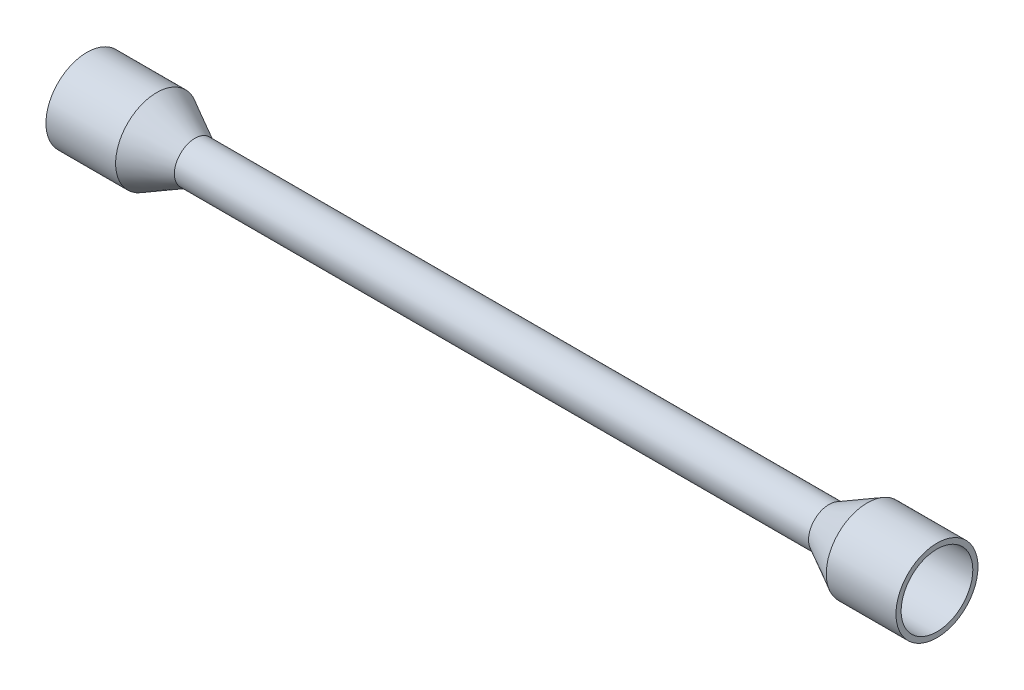
ISO-10303-21;
HEADER;
FILE_DESCRIPTION(('STEP AP214'),'2;1');
FILE_NAME('part.step','',(''),(''),'','','');
FILE_SCHEMA(('AUTOMOTIVE_DESIGN { 1 0 10303 214 1 1 1 1 }'));
ENDSEC;
DATA;
#1=APPLICATION_CONTEXT('core data for automotive mechanical design processes');
#2=APPLICATION_PROTOCOL_DEFINITION('international standard','automotive_design',2000,#1);
#3=PRODUCT_CONTEXT('',#1,'mechanical');
#4=PRODUCT('Part','Part','',(#3));
#5=PRODUCT_RELATED_PRODUCT_CATEGORY('part','',(#4));
#6=PRODUCT_DEFINITION_FORMATION('','',#4);
#7=PRODUCT_DEFINITION_CONTEXT('part definition',#1,'design');
#8=PRODUCT_DEFINITION('design','',#6,#7);
#9=PRODUCT_DEFINITION_SHAPE('','',#8);
#10=(LENGTH_UNIT() NAMED_UNIT(*) SI_UNIT(.MILLI.,.METRE.));
#11=(NAMED_UNIT(*) PLANE_ANGLE_UNIT() SI_UNIT($,.RADIAN.));
#12=(NAMED_UNIT(*) SI_UNIT($,.STERADIAN.) SOLID_ANGLE_UNIT());
#13=UNCERTAINTY_MEASURE_WITH_UNIT(LENGTH_MEASURE(1.E-05),#10,'distance_accuracy_value','');
#14=(GEOMETRIC_REPRESENTATION_CONTEXT(3) GLOBAL_UNCERTAINTY_ASSIGNED_CONTEXT((#13)) GLOBAL_UNIT_ASSIGNED_CONTEXT((#10,
#11,#12)) REPRESENTATION_CONTEXT('',''));
#15=CARTESIAN_POINT('',(0.,0.,0.));
#16=DIRECTION('',(0.,0.,1.));
#17=DIRECTION('',(1.,0.,0.));
#18=AXIS2_PLACEMENT_3D('',#15,#16,#17);
#19=CARTESIAN_POINT('',(-250.,0.,-21.075));
#20=DIRECTION('',(-1.,0.,0.));
#21=DIRECTION('',(0.,0.,1.));
#22=AXIS2_PLACEMENT_3D('',#19,#20,#21);
#23=PLANE('',#22);
#24=CARTESIAN_POINT('',(-250.,0.,0.));
#25=DIRECTION('',(1.,0.,0.));
#26=DIRECTION('',(0.,0.,-1.));
#27=AXIS2_PLACEMENT_3D('',#24,#25,#26);
#28=CIRCLE('',#27,21.075);
#29=CARTESIAN_POINT('',(-250.,0.,-21.075));
#30=VERTEX_POINT('',#29);
#31=EDGE_CURVE('E70',#30,#30,#28,.T.);
#32=ORIENTED_EDGE('',*,*,#31,.T.);
#33=EDGE_LOOP('',(#32));
#34=FACE_BOUND('',#33,.T.);
#35=CARTESIAN_POINT('',(-250.,0.,0.));
#36=DIRECTION('',(1.,0.,0.));
#37=DIRECTION('',(0.,0.,-1.));
#38=AXIS2_PLACEMENT_3D('',#35,#36,#37);
#39=CIRCLE('',#38,24.125);
#40=CARTESIAN_POINT('',(-250.,0.,-24.125));
#41=VERTEX_POINT('',#40);
#42=EDGE_CURVE('E10',#41,#41,#39,.T.);
#43=ORIENTED_EDGE('',*,*,#42,.F.);
#44=EDGE_LOOP('',(#43));
#45=FACE_BOUND('',#44,.T.);
#46=ADVANCED_FACE('F30',(#34,#45),#23,.T.);
#47=CARTESIAN_POINT('',(250.,0.,0.));
#48=DIRECTION('',(1.,0.,0.));
#49=DIRECTION('',(0.,0.,-1.));
#50=AXIS2_PLACEMENT_3D('',#47,#48,#49);
#51=CYLINDRICAL_SURFACE('',#50,24.125);
#52=ORIENTED_EDGE('',*,*,#42,.T.);
#53=EDGE_LOOP('',(#52));
#54=FACE_BOUND('',#53,.T.);
#55=CARTESIAN_POINT('',(-209.,0.,0.));
#56=DIRECTION('',(1.,0.,0.));
#57=DIRECTION('',(0.,0.,-1.));
#58=AXIS2_PLACEMENT_3D('',#55,#56,#57);
#59=CIRCLE('',#58,24.125);
#60=CARTESIAN_POINT('',(-209.,0.,-24.125));
#61=VERTEX_POINT('',#60);
#62=EDGE_CURVE('E36',#61,#61,#59,.T.);
#63=ORIENTED_EDGE('',*,*,#62,.F.);
#64=EDGE_LOOP('',(#63));
#65=FACE_BOUND('',#64,.T.);
#66=ADVANCED_FACE('F88',(#54,#65),#51,.T.);
#67=CARTESIAN_POINT('',(-186.495513174161,0.,0.));
#68=DIRECTION('',(-1.,0.,0.));
#69=DIRECTION('',(0.,0.,1.));
#70=AXIS2_PLACEMENT_3D('',#67,#68,#69);
#71=CONICAL_SURFACE('',#70,12.0625,0.492034432941357);
#72=ORIENTED_EDGE('',*,*,#62,.T.);
#73=EDGE_LOOP('',(#72));
#74=FACE_BOUND('',#73,.T.);
#75=CARTESIAN_POINT('',(-186.495513174161,0.,0.));
#76=DIRECTION('',(1.,0.,0.));
#77=DIRECTION('',(0.,0.,-1.));
#78=AXIS2_PLACEMENT_3D('',#75,#76,#77);
#79=CIRCLE('',#78,12.0625);
#80=CARTESIAN_POINT('',(-186.495513174161,0.,-12.0625));
#81=VERTEX_POINT('',#80);
#82=EDGE_CURVE('E40',#81,#81,#79,.T.);
#83=ORIENTED_EDGE('',*,*,#82,.F.);
#84=EDGE_LOOP('',(#83));
#85=FACE_BOUND('',#84,.T.);
#86=ADVANCED_FACE('F92',(#74,#85),#71,.T.);
#87=CARTESIAN_POINT('',(250.,0.,0.));
#88=DIRECTION('',(1.,0.,0.));
#89=DIRECTION('',(0.,0.,-1.));
#90=AXIS2_PLACEMENT_3D('',#87,#88,#89);
#91=CYLINDRICAL_SURFACE('',#90,12.0625);
#92=ORIENTED_EDGE('',*,*,#82,.T.);
#93=EDGE_LOOP('',(#92));
#94=FACE_BOUND('',#93,.T.);
#95=CARTESIAN_POINT('',(186.495513174161,0.,0.));
#96=DIRECTION('',(1.,0.,0.));
#97=DIRECTION('',(0.,0.,-1.));
#98=AXIS2_PLACEMENT_3D('',#95,#96,#97);
#99=CIRCLE('',#98,12.0625);
#100=CARTESIAN_POINT('',(186.495513174161,0.,-12.0625));
#101=VERTEX_POINT('',#100);
#102=EDGE_CURVE('E44',#101,#101,#99,.T.);
#103=ORIENTED_EDGE('',*,*,#102,.F.);
#104=EDGE_LOOP('',(#103));
#105=FACE_BOUND('',#104,.T.);
#106=ADVANCED_FACE('F96',(#94,#105),#91,.T.);
#107=CARTESIAN_POINT('',(209.,0.,0.));
#108=DIRECTION('',(1.,0.,0.));
#109=DIRECTION('',(0.,0.,-1.));
#110=AXIS2_PLACEMENT_3D('',#107,#108,#109);
#111=CONICAL_SURFACE('',#110,24.125,0.492034432941357);
#112=ORIENTED_EDGE('',*,*,#102,.T.);
#113=EDGE_LOOP('',(#112));
#114=FACE_BOUND('',#113,.T.);
#115=CARTESIAN_POINT('',(209.,0.,0.));
#116=DIRECTION('',(1.,0.,0.));
#117=DIRECTION('',(0.,0.,-1.));
#118=AXIS2_PLACEMENT_3D('',#115,#116,#117);
#119=CIRCLE('',#118,24.125);
#120=CARTESIAN_POINT('',(209.,0.,-24.125));
#121=VERTEX_POINT('',#120);
#122=EDGE_CURVE('E49',#121,#121,#119,.T.);
#123=ORIENTED_EDGE('',*,*,#122,.F.);
#124=EDGE_LOOP('',(#123));
#125=FACE_BOUND('',#124,.T.);
#126=ADVANCED_FACE('F102',(#114,#125),#111,.T.);
#127=CARTESIAN_POINT('',(250.,0.,0.));
#128=DIRECTION('',(1.,0.,0.));
#129=DIRECTION('',(0.,0.,-1.));
#130=AXIS2_PLACEMENT_3D('',#127,#128,#129);
#131=CYLINDRICAL_SURFACE('',#130,24.125);
#132=ORIENTED_EDGE('',*,*,#122,.T.);
#133=EDGE_LOOP('',(#132));
#134=FACE_BOUND('',#133,.T.);
#135=CARTESIAN_POINT('',(250.,0.,0.));
#136=DIRECTION('',(1.,0.,0.));
#137=DIRECTION('',(0.,0.,-1.));
#138=AXIS2_PLACEMENT_3D('',#135,#136,#137);
#139=CIRCLE('',#138,24.125);
#140=CARTESIAN_POINT('',(250.,0.,-24.125));
#141=VERTEX_POINT('',#140);
#142=EDGE_CURVE('E52',#141,#141,#139,.T.);
#143=ORIENTED_EDGE('',*,*,#142,.F.);
#144=EDGE_LOOP('',(#143));
#145=FACE_BOUND('',#144,.T.);
#146=ADVANCED_FACE('F106',(#134,#145),#131,.T.);
#147=CARTESIAN_POINT('',(250.,0.,-24.125));
#148=DIRECTION('',(1.,0.,0.));
#149=DIRECTION('',(0.,0.,-1.));
#150=AXIS2_PLACEMENT_3D('',#147,#148,#149);
#151=PLANE('',#150);
#152=ORIENTED_EDGE('',*,*,#142,.T.);
#153=EDGE_LOOP('',(#152));
#154=FACE_BOUND('',#153,.T.);
#155=CARTESIAN_POINT('',(250.,0.,0.));
#156=DIRECTION('',(1.,0.,0.));
#157=DIRECTION('',(0.,0.,-1.));
#158=AXIS2_PLACEMENT_3D('',#155,#156,#157);
#159=CIRCLE('',#158,21.075);
#160=CARTESIAN_POINT('',(250.,0.,-21.075));
#161=VERTEX_POINT('',#160);
#162=EDGE_CURVE('E55',#161,#161,#159,.T.);
#163=ORIENTED_EDGE('',*,*,#162,.F.);
#164=EDGE_LOOP('',(#163));
#165=FACE_BOUND('',#164,.T.);
#166=ADVANCED_FACE('F110',(#154,#165),#151,.T.);
#167=CARTESIAN_POINT('',(250.,0.,0.));
#168=DIRECTION('',(1.,0.,0.));
#169=DIRECTION('',(0.,0.,-1.));
#170=AXIS2_PLACEMENT_3D('',#167,#168,#169);
#171=CYLINDRICAL_SURFACE('',#170,21.075);
#172=ORIENTED_EDGE('',*,*,#162,.T.);
#173=EDGE_LOOP('',(#172));
#174=FACE_BOUND('',#173,.T.);
#175=CARTESIAN_POINT('',(209.765866437196,0.,0.));
#176=DIRECTION('',(1.,0.,0.));
#177=DIRECTION('',(0.,0.,-1.));
#178=AXIS2_PLACEMENT_3D('',#175,#176,#177);
#179=CIRCLE('',#178,21.075);
#180=CARTESIAN_POINT('',(209.765866437196,0.,-21.075));
#181=VERTEX_POINT('',#180);
#182=EDGE_CURVE('E58',#181,#181,#179,.T.);
#183=ORIENTED_EDGE('',*,*,#182,.F.);
#184=EDGE_LOOP('',(#183));
#185=FACE_BOUND('',#184,.T.);
#186=ADVANCED_FACE('F114',(#174,#185),#171,.F.);
#187=CARTESIAN_POINT('',(187.261379611358,0.,0.));
#188=DIRECTION('',(1.,0.,0.));
#189=DIRECTION('',(0.,0.,-1.));
#190=AXIS2_PLACEMENT_3D('',#187,#188,#189);
#191=CONICAL_SURFACE('',#190,9.0125,0.492034432941357);
#192=ORIENTED_EDGE('',*,*,#182,.T.);
#193=EDGE_LOOP('',(#192));
#194=FACE_BOUND('',#193,.T.);
#195=CARTESIAN_POINT('',(187.261379611358,0.,0.));
#196=DIRECTION('',(1.,0.,0.));
#197=DIRECTION('',(0.,0.,-1.));
#198=AXIS2_PLACEMENT_3D('',#195,#196,#197);
#199=CIRCLE('',#198,9.0125);
#200=CARTESIAN_POINT('',(187.261379611358,0.,-9.01249999999997));
#201=VERTEX_POINT('',#200);
#202=EDGE_CURVE('E61',#201,#201,#199,.T.);
#203=ORIENTED_EDGE('',*,*,#202,.F.);
#204=EDGE_LOOP('',(#203));
#205=FACE_BOUND('',#204,.T.);
#206=ADVANCED_FACE('F118',(#194,#205),#191,.F.);
#207=CARTESIAN_POINT('',(187.261379611358,0.,-9.01249999999997));
#208=DIRECTION('',(1.,0.,0.));
#209=DIRECTION('',(0.,0.,-1.));
#210=AXIS2_PLACEMENT_3D('',#207,#208,#209);
#211=PLANE('',#210);
#212=ORIENTED_EDGE('',*,*,#202,.T.);
#213=EDGE_LOOP('',(#212));
#214=FACE_BOUND('',#213,.T.);
#215=ADVANCED_FACE('F122',(#214),#211,.T.);
#216=CARTESIAN_POINT('',(-187.261379611358,0.,-9.01249999999997));
#217=DIRECTION('',(-1.,0.,0.));
#218=DIRECTION('',(0.,0.,1.));
#219=AXIS2_PLACEMENT_3D('',#216,#217,#218);
#220=PLANE('',#219);
#221=CARTESIAN_POINT('',(-187.261379611358,0.,0.));
#222=DIRECTION('',(1.,0.,0.));
#223=DIRECTION('',(0.,0.,-1.));
#224=AXIS2_PLACEMENT_3D('',#221,#222,#223);
#225=CIRCLE('',#224,9.0125);
#226=CARTESIAN_POINT('',(-187.261379611358,0.,-9.01249999999997));
#227=VERTEX_POINT('',#226);
#228=EDGE_CURVE('E64',#227,#227,#225,.T.);
#229=ORIENTED_EDGE('',*,*,#228,.F.);
#230=EDGE_LOOP('',(#229));
#231=FACE_BOUND('',#230,.T.);
#232=ADVANCED_FACE('F84',(#231),#220,.T.);
#233=CARTESIAN_POINT('',(-209.765866437196,0.,0.));
#234=DIRECTION('',(-1.,0.,0.));
#235=DIRECTION('',(0.,0.,1.));
#236=AXIS2_PLACEMENT_3D('',#233,#234,#235);
#237=CONICAL_SURFACE('',#236,21.075,0.492034432941356);
#238=ORIENTED_EDGE('',*,*,#228,.T.);
#239=EDGE_LOOP('',(#238));
#240=FACE_BOUND('',#239,.T.);
#241=CARTESIAN_POINT('',(-209.765866437196,0.,0.));
#242=DIRECTION('',(1.,0.,0.));
#243=DIRECTION('',(0.,0.,-1.));
#244=AXIS2_PLACEMENT_3D('',#241,#242,#243);
#245=CIRCLE('',#244,21.075);
#246=CARTESIAN_POINT('',(-209.765866437196,0.,-21.075));
#247=VERTEX_POINT('',#246);
#248=EDGE_CURVE('E67',#247,#247,#245,.T.);
#249=ORIENTED_EDGE('',*,*,#248,.F.);
#250=EDGE_LOOP('',(#249));
#251=FACE_BOUND('',#250,.T.);
#252=ADVANCED_FACE('F78',(#240,#251),#237,.F.);
#253=CARTESIAN_POINT('',(250.,0.,0.));
#254=DIRECTION('',(1.,0.,0.));
#255=DIRECTION('',(0.,0.,-1.));
#256=AXIS2_PLACEMENT_3D('',#253,#254,#255);
#257=CYLINDRICAL_SURFACE('',#256,21.075);
#258=ORIENTED_EDGE('',*,*,#248,.T.);
#259=EDGE_LOOP('',(#258));
#260=FACE_BOUND('',#259,.T.);
#261=ORIENTED_EDGE('',*,*,#31,.F.);
#262=EDGE_LOOP('',(#261));
#263=FACE_BOUND('',#262,.T.);
#264=ADVANCED_FACE('F76',(#260,#263),#257,.F.);
#265=CLOSED_SHELL('',(#46,#66,#86,#106,#126,#146,#166,#186,#206,#215,#232,#252,#264));
#266=MANIFOLD_SOLID_BREP('B2',#265);
#267=ADVANCED_BREP_SHAPE_REPRESENTATION('',(#18,#266),#14);
#268=SHAPE_DEFINITION_REPRESENTATION(#9,#267);
ENDSEC;
END-ISO-10303-21;
